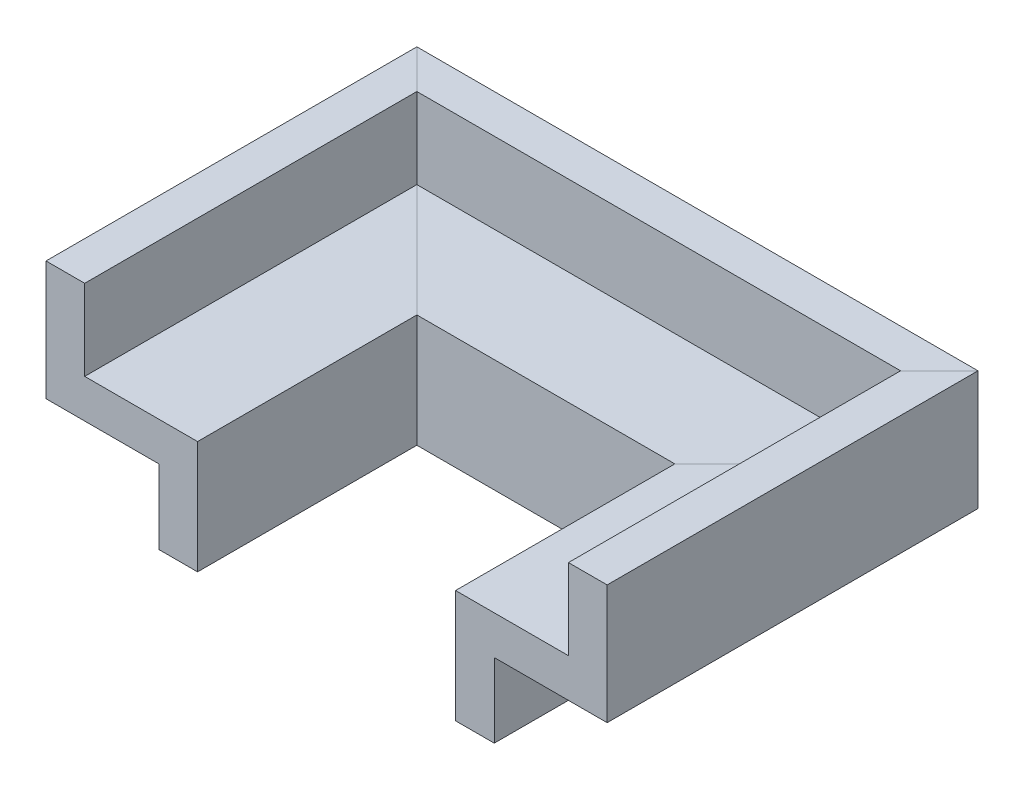
ISO-10303-21;
HEADER;
FILE_DESCRIPTION(('STEP AP214'),'2;1');
FILE_NAME('part.step','',(''),(''),'','','');
FILE_SCHEMA(('AUTOMOTIVE_DESIGN { 1 0 10303 214 1 1 1 1 }'));
ENDSEC;
DATA;
#1=APPLICATION_CONTEXT('core data for automotive mechanical design processes');
#2=APPLICATION_PROTOCOL_DEFINITION('international standard','automotive_design',2000,#1);
#3=PRODUCT_CONTEXT('',#1,'mechanical');
#4=PRODUCT('Part','Part','',(#3));
#5=PRODUCT_RELATED_PRODUCT_CATEGORY('part','',(#4));
#6=PRODUCT_DEFINITION_FORMATION('','',#4);
#7=PRODUCT_DEFINITION_CONTEXT('part definition',#1,'design');
#8=PRODUCT_DEFINITION('design','',#6,#7);
#9=PRODUCT_DEFINITION_SHAPE('','',#8);
#10=(LENGTH_UNIT() NAMED_UNIT(*) SI_UNIT(.MILLI.,.METRE.));
#11=(NAMED_UNIT(*) PLANE_ANGLE_UNIT() SI_UNIT($,.RADIAN.));
#12=(NAMED_UNIT(*) SI_UNIT($,.STERADIAN.) SOLID_ANGLE_UNIT());
#13=UNCERTAINTY_MEASURE_WITH_UNIT(LENGTH_MEASURE(1.E-05),#10,'distance_accuracy_value','');
#14=(GEOMETRIC_REPRESENTATION_CONTEXT(3) GLOBAL_UNCERTAINTY_ASSIGNED_CONTEXT((#13)) GLOBAL_UNIT_ASSIGNED_CONTEXT((#10,
#11,#12)) REPRESENTATION_CONTEXT('',''));
#15=CARTESIAN_POINT('',(0.,0.,0.));
#16=DIRECTION('',(0.,0.,1.));
#17=DIRECTION('',(1.,0.,0.));
#18=AXIS2_PLACEMENT_3D('',#15,#16,#17);
#19=CARTESIAN_POINT('',(0.,0.,0.));
#20=DIRECTION('',(0.,0.,-1.));
#21=DIRECTION('',(-1.,0.,0.));
#22=AXIS2_PLACEMENT_3D('',#19,#20,#21);
#23=PLANE('',#22);
#24=DIRECTION('',(0.,-1.,0.));
#25=VECTOR('',#24,1.);
#26=CARTESIAN_POINT('',(52.,-23.,0.));
#27=LINE('',#26,#25);
#28=CARTESIAN_POINT('',(52.,0.,0.));
#29=VERTEX_POINT('',#28);
#30=CARTESIAN_POINT('',(52.,-23.,0.));
#31=VERTEX_POINT('',#30);
#32=EDGE_CURVE('E127',#29,#31,#27,.T.);
#33=ORIENTED_EDGE('',*,*,#32,.F.);
#34=DIRECTION('',(-1.,0.,0.));
#35=VECTOR('',#34,1.);
#36=CARTESIAN_POINT('',(52.,0.,0.));
#37=LINE('',#36,#35);
#38=CARTESIAN_POINT('',(87.,0.,0.));
#39=VERTEX_POINT('',#38);
#40=EDGE_CURVE('E181',#39,#29,#37,.T.);
#41=ORIENTED_EDGE('',*,*,#40,.F.);
#42=DIRECTION('',(0.,-1.,0.));
#43=VECTOR('',#42,1.);
#44=CARTESIAN_POINT('',(87.,0.,0.));
#45=LINE('',#44,#43);
#46=CARTESIAN_POINT('',(87.,37.,0.));
#47=VERTEX_POINT('',#46);
#48=EDGE_CURVE('E178',#47,#39,#45,.T.);
#49=ORIENTED_EDGE('',*,*,#48,.F.);
#50=DIRECTION('',(1.,0.,0.));
#51=VECTOR('',#50,1.);
#52=CARTESIAN_POINT('',(87.,37.,0.));
#53=LINE('',#52,#51);
#54=CARTESIAN_POINT('',(75.,37.,0.));
#55=VERTEX_POINT('',#54);
#56=EDGE_CURVE('E175',#55,#47,#53,.T.);
#57=ORIENTED_EDGE('',*,*,#56,.F.);
#58=DIRECTION('',(0.,1.,0.));
#59=VECTOR('',#58,1.);
#60=CARTESIAN_POINT('',(75.,37.,0.));
#61=LINE('',#60,#59);
#62=CARTESIAN_POINT('',(75.,12.,0.));
#63=VERTEX_POINT('',#62);
#64=EDGE_CURVE('E172',#63,#55,#61,.T.);
#65=ORIENTED_EDGE('',*,*,#64,.F.);
#66=DIRECTION('',(1.,0.,0.));
#67=VECTOR('',#66,1.);
#68=CARTESIAN_POINT('',(75.,12.,0.));
#69=LINE('',#68,#67);
#70=CARTESIAN_POINT('',(40.,12.,0.));
#71=VERTEX_POINT('',#70);
#72=EDGE_CURVE('E130',#71,#63,#69,.T.);
#73=ORIENTED_EDGE('',*,*,#72,.F.);
#74=DIRECTION('',(0.,1.,0.));
#75=VECTOR('',#74,1.);
#76=CARTESIAN_POINT('',(40.,12.,0.));
#77=LINE('',#76,#75);
#78=CARTESIAN_POINT('',(40.,-23.,0.));
#79=VERTEX_POINT('',#78);
#80=EDGE_CURVE('E111',#79,#71,#77,.T.);
#81=ORIENTED_EDGE('',*,*,#80,.F.);
#82=DIRECTION('',(-1.,0.,0.));
#83=VECTOR('',#82,1.);
#84=CARTESIAN_POINT('',(40.,-23.,0.));
#85=LINE('',#84,#83);
#86=EDGE_CURVE('E118',#31,#79,#85,.T.);
#87=ORIENTED_EDGE('',*,*,#86,.F.);
#88=EDGE_LOOP('',(#33,#41,#49,#57,#65,#73,#81,#87));
#89=FACE_BOUND('',#88,.T.);
#90=ADVANCED_FACE('F39',(#89),#23,.F.);
#91=CARTESIAN_POINT('',(0.,0.,0.));
#92=DIRECTION('',(0.,0.,1.));
#93=DIRECTION('',(1.,0.,0.));
#94=AXIS2_PLACEMENT_3D('',#91,#92,#93);
#95=PLANE('',#94);
#96=DIRECTION('',(0.,-1.,0.));
#97=VECTOR('',#96,1.);
#98=CARTESIAN_POINT('',(-52.,-23.,0.));
#99=LINE('',#98,#97);
#100=CARTESIAN_POINT('',(-52.,0.,0.));
#101=VERTEX_POINT('',#100);
#102=CARTESIAN_POINT('',(-52.,-23.,0.));
#103=VERTEX_POINT('',#102);
#104=EDGE_CURVE('E252',#101,#103,#99,.T.);
#105=ORIENTED_EDGE('',*,*,#104,.T.);
#106=DIRECTION('',(1.,0.,0.));
#107=VECTOR('',#106,1.);
#108=CARTESIAN_POINT('',(-40.,-23.,0.));
#109=LINE('',#108,#107);
#110=CARTESIAN_POINT('',(-40.,-23.,0.));
#111=VERTEX_POINT('',#110);
#112=EDGE_CURVE('E247',#103,#111,#109,.T.);
#113=ORIENTED_EDGE('',*,*,#112,.T.);
#114=DIRECTION('',(0.,1.,0.));
#115=VECTOR('',#114,1.);
#116=CARTESIAN_POINT('',(-40.,12.,0.));
#117=LINE('',#116,#115);
#118=CARTESIAN_POINT('',(-40.,12.,0.));
#119=VERTEX_POINT('',#118);
#120=EDGE_CURVE('E240',#111,#119,#117,.T.);
#121=ORIENTED_EDGE('',*,*,#120,.T.);
#122=DIRECTION('',(-1.,0.,0.));
#123=VECTOR('',#122,1.);
#124=CARTESIAN_POINT('',(-75.,12.,0.));
#125=LINE('',#124,#123);
#126=CARTESIAN_POINT('',(-75.,12.,0.));
#127=VERTEX_POINT('',#126);
#128=EDGE_CURVE('E292',#119,#127,#125,.T.);
#129=ORIENTED_EDGE('',*,*,#128,.T.);
#130=DIRECTION('',(0.,1.,0.));
#131=VECTOR('',#130,1.);
#132=CARTESIAN_POINT('',(-75.,37.,0.));
#133=LINE('',#132,#131);
#134=CARTESIAN_POINT('',(-75.,37.,0.));
#135=VERTEX_POINT('',#134);
#136=EDGE_CURVE('E284',#127,#135,#133,.T.);
#137=ORIENTED_EDGE('',*,*,#136,.T.);
#138=DIRECTION('',(-1.,0.,0.));
#139=VECTOR('',#138,1.);
#140=CARTESIAN_POINT('',(-87.,37.,0.));
#141=LINE('',#140,#139);
#142=CARTESIAN_POINT('',(-87.,37.,0.));
#143=VERTEX_POINT('',#142);
#144=EDGE_CURVE('E276',#135,#143,#141,.T.);
#145=ORIENTED_EDGE('',*,*,#144,.T.);
#146=DIRECTION('',(0.,-1.,0.));
#147=VECTOR('',#146,1.);
#148=CARTESIAN_POINT('',(-87.,0.,0.));
#149=LINE('',#148,#147);
#150=CARTESIAN_POINT('',(-87.,0.,0.));
#151=VERTEX_POINT('',#150);
#152=EDGE_CURVE('E268',#143,#151,#149,.T.);
#153=ORIENTED_EDGE('',*,*,#152,.T.);
#154=DIRECTION('',(1.,0.,0.));
#155=VECTOR('',#154,1.);
#156=CARTESIAN_POINT('',(-52.,0.,0.));
#157=LINE('',#156,#155);
#158=EDGE_CURVE('E260',#151,#101,#157,.T.);
#159=ORIENTED_EDGE('',*,*,#158,.T.);
#160=EDGE_LOOP('',(#105,#113,#121,#129,#137,#145,#153,#159));
#161=FACE_BOUND('',#160,.T.);
#162=ADVANCED_FACE('F388',(#161),#95,.T.);
#163=CARTESIAN_POINT('',(40.,12.,-118.6));
#164=DIRECTION('',(1.,0.,0.));
#165=DIRECTION('',(0.,1.,0.));
#166=AXIS2_PLACEMENT_3D('',#163,#164,#165);
#167=PLANE('',#166);
#168=DIRECTION('',(0.,-1.,0.));
#169=VECTOR('',#168,1.);
#170=CARTESIAN_POINT('',(40.,12.,-68.));
#171=LINE('',#170,#169);
#172=CARTESIAN_POINT('',(40.,12.,-68.));
#173=VERTEX_POINT('',#172);
#174=CARTESIAN_POINT('',(40.,-23.,-68.));
#175=VERTEX_POINT('',#174);
#176=EDGE_CURVE('E135',#173,#175,#171,.T.);
#177=ORIENTED_EDGE('',*,*,#176,.T.);
#178=DIRECTION('',(0.,0.,1.));
#179=VECTOR('',#178,1.);
#180=CARTESIAN_POINT('',(40.,-23.,-118.6));
#181=LINE('',#180,#179);
#182=EDGE_CURVE('E42',#175,#79,#181,.T.);
#183=ORIENTED_EDGE('',*,*,#182,.T.);
#184=ORIENTED_EDGE('',*,*,#80,.T.);
#185=DIRECTION('',(0.,0.,1.));
#186=VECTOR('',#185,1.);
#187=CARTESIAN_POINT('',(40.,12.,-118.6));
#188=LINE('',#187,#186);
#189=EDGE_CURVE('E139',#173,#71,#188,.T.);
#190=ORIENTED_EDGE('',*,*,#189,.F.);
#191=EDGE_LOOP('',(#177,#183,#184,#190));
#192=FACE_BOUND('',#191,.T.);
#193=ADVANCED_FACE('F134',(#192),#167,.F.);
#194=CARTESIAN_POINT('',(75.,12.,-118.6));
#195=DIRECTION('',(0.,-1.,0.));
#196=DIRECTION('',(0.,0.,-1.));
#197=AXIS2_PLACEMENT_3D('',#194,#195,#196);
#198=PLANE('',#197);
#199=DIRECTION('',(-0.707106781186548,0.,0.707106781186548));
#200=VECTOR('',#199,1.);
#201=CARTESIAN_POINT('',(-7.8,12.,-20.2));
#202=LINE('',#201,#200);
#203=CARTESIAN_POINT('',(75.,12.,-103.));
#204=VERTEX_POINT('',#203);
#205=EDGE_CURVE('E237',#204,#173,#202,.T.);
#206=ORIENTED_EDGE('',*,*,#205,.T.);
#207=ORIENTED_EDGE('',*,*,#189,.T.);
#208=ORIENTED_EDGE('',*,*,#72,.T.);
#209=DIRECTION('',(0.,0.,1.));
#210=VECTOR('',#209,1.);
#211=CARTESIAN_POINT('',(75.,12.,-118.6));
#212=LINE('',#211,#210);
#213=EDGE_CURVE('E145',#204,#63,#212,.T.);
#214=ORIENTED_EDGE('',*,*,#213,.F.);
#215=EDGE_LOOP('',(#206,#207,#208,#214));
#216=FACE_BOUND('',#215,.T.);
#217=ADVANCED_FACE('F400',(#216),#198,.F.);
#218=CARTESIAN_POINT('',(75.,37.,-118.6));
#219=DIRECTION('',(1.,0.,0.));
#220=DIRECTION('',(0.,1.,0.));
#221=AXIS2_PLACEMENT_3D('',#218,#219,#220);
#222=PLANE('',#221);
#223=DIRECTION('',(0.,-1.,0.));
#224=VECTOR('',#223,1.);
#225=CARTESIAN_POINT('',(75.,36.9999999999999,-103.));
#226=LINE('',#225,#224);
#227=CARTESIAN_POINT('',(75.,37.,-103.));
#228=VERTEX_POINT('',#227);
#229=EDGE_CURVE('E233',#228,#204,#226,.T.);
#230=ORIENTED_EDGE('',*,*,#229,.T.);
#231=ORIENTED_EDGE('',*,*,#213,.T.);
#232=ORIENTED_EDGE('',*,*,#64,.T.);
#233=DIRECTION('',(0.,0.,1.));
#234=VECTOR('',#233,1.);
#235=CARTESIAN_POINT('',(75.,37.,-118.6));
#236=LINE('',#235,#234);
#237=EDGE_CURVE('E150',#228,#55,#236,.T.);
#238=ORIENTED_EDGE('',*,*,#237,.F.);
#239=EDGE_LOOP('',(#230,#231,#232,#238));
#240=FACE_BOUND('',#239,.T.);
#241=ADVANCED_FACE('F403',(#240),#222,.F.);
#242=CARTESIAN_POINT('',(87.,37.,-118.6));
#243=DIRECTION('',(0.,-1.,0.));
#244=DIRECTION('',(0.,0.,-1.));
#245=AXIS2_PLACEMENT_3D('',#242,#243,#244);
#246=PLANE('',#245);
#247=DIRECTION('',(-0.707106781186548,0.,0.707106781186548));
#248=VECTOR('',#247,1.);
#249=CARTESIAN_POINT('',(-1.8,37.,-26.2));
#250=LINE('',#249,#248);
#251=CARTESIAN_POINT('',(87.,37.,-115.));
#252=VERTEX_POINT('',#251);
#253=EDGE_CURVE('E229',#252,#228,#250,.T.);
#254=ORIENTED_EDGE('',*,*,#253,.T.);
#255=ORIENTED_EDGE('',*,*,#237,.T.);
#256=ORIENTED_EDGE('',*,*,#56,.T.);
#257=DIRECTION('',(0.,0.,1.));
#258=VECTOR('',#257,1.);
#259=CARTESIAN_POINT('',(87.,37.,-118.6));
#260=LINE('',#259,#258);
#261=EDGE_CURVE('E156',#252,#47,#260,.T.);
#262=ORIENTED_EDGE('',*,*,#261,.F.);
#263=EDGE_LOOP('',(#254,#255,#256,#262));
#264=FACE_BOUND('',#263,.T.);
#265=ADVANCED_FACE('F406',(#264),#246,.F.);
#266=CARTESIAN_POINT('',(87.,0.,-118.6));
#267=DIRECTION('',(-1.,0.,0.));
#268=DIRECTION('',(0.,0.,1.));
#269=AXIS2_PLACEMENT_3D('',#266,#267,#268);
#270=PLANE('',#269);
#271=DIRECTION('',(0.,1.,0.));
#272=VECTOR('',#271,1.);
#273=CARTESIAN_POINT('',(87.,0.,-115.));
#274=LINE('',#273,#272);
#275=CARTESIAN_POINT('',(87.,0.,-115.));
#276=VERTEX_POINT('',#275);
#277=EDGE_CURVE('E225',#276,#252,#274,.T.);
#278=ORIENTED_EDGE('',*,*,#277,.T.);
#279=ORIENTED_EDGE('',*,*,#261,.T.);
#280=ORIENTED_EDGE('',*,*,#48,.T.);
#281=DIRECTION('',(0.,0.,1.));
#282=VECTOR('',#281,1.);
#283=CARTESIAN_POINT('',(87.,0.,-118.6));
#284=LINE('',#283,#282);
#285=EDGE_CURVE('E160',#276,#39,#284,.T.);
#286=ORIENTED_EDGE('',*,*,#285,.F.);
#287=EDGE_LOOP('',(#278,#279,#280,#286));
#288=FACE_BOUND('',#287,.T.);
#289=ADVANCED_FACE('F410',(#288),#270,.F.);
#290=CARTESIAN_POINT('',(52.,0.,-118.6));
#291=DIRECTION('',(0.,1.,0.));
#292=DIRECTION('',(-1.,0.,0.));
#293=AXIS2_PLACEMENT_3D('',#290,#291,#292);
#294=PLANE('',#293);
#295=DIRECTION('',(0.707106781186548,0.,-0.707106781186548));
#296=VECTOR('',#295,1.);
#297=CARTESIAN_POINT('',(-19.3,0.,-8.7));
#298=LINE('',#297,#296);
#299=CARTESIAN_POINT('',(52.,0.,-80.));
#300=VERTEX_POINT('',#299);
#301=EDGE_CURVE('E221',#300,#276,#298,.T.);
#302=ORIENTED_EDGE('',*,*,#301,.T.);
#303=ORIENTED_EDGE('',*,*,#285,.T.);
#304=ORIENTED_EDGE('',*,*,#40,.T.);
#305=DIRECTION('',(0.,0.,1.));
#306=VECTOR('',#305,1.);
#307=CARTESIAN_POINT('',(52.,0.,-118.6));
#308=LINE('',#307,#306);
#309=EDGE_CURVE('E164',#300,#29,#308,.T.);
#310=ORIENTED_EDGE('',*,*,#309,.F.);
#311=EDGE_LOOP('',(#302,#303,#304,#310));
#312=FACE_BOUND('',#311,.T.);
#313=ADVANCED_FACE('F414',(#312),#294,.F.);
#314=CARTESIAN_POINT('',(52.,-23.,-118.6));
#315=DIRECTION('',(-1.,0.,0.));
#316=DIRECTION('',(0.,0.,1.));
#317=AXIS2_PLACEMENT_3D('',#314,#315,#316);
#318=PLANE('',#317);
#319=DIRECTION('',(0.,1.,0.));
#320=VECTOR('',#319,1.);
#321=CARTESIAN_POINT('',(52.,-23.,-80.));
#322=LINE('',#321,#320);
#323=CARTESIAN_POINT('',(52.,-23.,-80.));
#324=VERTEX_POINT('',#323);
#325=EDGE_CURVE('E217',#324,#300,#322,.T.);
#326=ORIENTED_EDGE('',*,*,#325,.T.);
#327=ORIENTED_EDGE('',*,*,#309,.T.);
#328=ORIENTED_EDGE('',*,*,#32,.T.);
#329=DIRECTION('',(0.,0.,1.));
#330=VECTOR('',#329,1.);
#331=CARTESIAN_POINT('',(52.,-23.,-118.6));
#332=LINE('',#331,#330);
#333=EDGE_CURVE('E123',#324,#31,#332,.T.);
#334=ORIENTED_EDGE('',*,*,#333,.F.);
#335=EDGE_LOOP('',(#326,#327,#328,#334));
#336=FACE_BOUND('',#335,.T.);
#337=ADVANCED_FACE('F433',(#336),#318,.F.);
#338=CARTESIAN_POINT('',(40.,-23.,-118.6));
#339=DIRECTION('',(0.,1.,0.));
#340=DIRECTION('',(0.,0.,1.));
#341=AXIS2_PLACEMENT_3D('',#338,#339,#340);
#342=PLANE('',#341);
#343=DIRECTION('',(0.707106781186548,0.,-0.707106781186548));
#344=VECTOR('',#343,1.);
#345=CARTESIAN_POINT('',(-25.3,-23.,-2.70000000000001));
#346=LINE('',#345,#344);
#347=EDGE_CURVE('E188',#175,#324,#346,.T.);
#348=ORIENTED_EDGE('',*,*,#347,.T.);
#349=ORIENTED_EDGE('',*,*,#333,.T.);
#350=ORIENTED_EDGE('',*,*,#86,.T.);
#351=ORIENTED_EDGE('',*,*,#182,.F.);
#352=EDGE_LOOP('',(#348,#349,#350,#351));
#353=FACE_BOUND('',#352,.T.);
#354=ADVANCED_FACE('F120',(#353),#342,.F.);
#355=CARTESIAN_POINT('',(-90.6,-23.,-68.));
#356=DIRECTION('',(0.,1.,0.));
#357=DIRECTION('',(0.,0.,1.));
#358=AXIS2_PLACEMENT_3D('',#355,#356,#357);
#359=PLANE('',#358);
#360=DIRECTION('',(1.,0.,0.));
#361=VECTOR('',#360,1.);
#362=CARTESIAN_POINT('',(-90.6,-23.,-68.));
#363=LINE('',#362,#361);
#364=CARTESIAN_POINT('',(-40.,-23.,-68.));
#365=VERTEX_POINT('',#364);
#366=EDGE_CURVE('E189',#365,#175,#363,.T.);
#367=ORIENTED_EDGE('',*,*,#366,.F.);
#368=DIRECTION('',(-0.707106781186548,0.,-0.707106781186548));
#369=VECTOR('',#368,1.);
#370=CARTESIAN_POINT('',(-6.,-23.,-34.));
#371=LINE('',#370,#369);
#372=CARTESIAN_POINT('',(-52.,-23.,-80.));
#373=VERTEX_POINT('',#372);
#374=EDGE_CURVE('E245',#365,#373,#371,.T.);
#375=ORIENTED_EDGE('',*,*,#374,.T.);
#376=DIRECTION('',(1.,0.,0.));
#377=VECTOR('',#376,1.);
#378=CARTESIAN_POINT('',(-90.6,-23.,-80.));
#379=LINE('',#378,#377);
#380=EDGE_CURVE('E138',#373,#324,#379,.T.);
#381=ORIENTED_EDGE('',*,*,#380,.T.);
#382=ORIENTED_EDGE('',*,*,#347,.F.);
#383=EDGE_LOOP('',(#367,#375,#381,#382));
#384=FACE_BOUND('',#383,.T.);
#385=ADVANCED_FACE('F429',(#384),#359,.F.);
#386=CARTESIAN_POINT('',(-90.6,-23.,-80.));
#387=DIRECTION('',(0.,0.,1.));
#388=DIRECTION('',(1.,0.,0.));
#389=AXIS2_PLACEMENT_3D('',#386,#387,#388);
#390=PLANE('',#389);
#391=ORIENTED_EDGE('',*,*,#380,.F.);
#392=DIRECTION('',(0.,1.,0.));
#393=VECTOR('',#392,1.);
#394=CARTESIAN_POINT('',(-52.,-23.,-80.));
#395=LINE('',#394,#393);
#396=CARTESIAN_POINT('',(-52.,0.,-80.));
#397=VERTEX_POINT('',#396);
#398=EDGE_CURVE('E311',#373,#397,#395,.T.);
#399=ORIENTED_EDGE('',*,*,#398,.T.);
#400=DIRECTION('',(1.,0.,0.));
#401=VECTOR('',#400,1.);
#402=CARTESIAN_POINT('',(-90.6,0.,-80.));
#403=LINE('',#402,#401);
#404=EDGE_CURVE('E143',#397,#300,#403,.T.);
#405=ORIENTED_EDGE('',*,*,#404,.T.);
#406=ORIENTED_EDGE('',*,*,#325,.F.);
#407=EDGE_LOOP('',(#391,#399,#405,#406));
#408=FACE_BOUND('',#407,.T.);
#409=ADVANCED_FACE('F431',(#408),#390,.F.);
#410=CARTESIAN_POINT('',(-90.6,0.,-80.));
#411=DIRECTION('',(0.,1.,0.));
#412=DIRECTION('',(0.,0.,1.));
#413=AXIS2_PLACEMENT_3D('',#410,#411,#412);
#414=PLANE('',#413);
#415=ORIENTED_EDGE('',*,*,#404,.F.);
#416=DIRECTION('',(-0.707106781186548,0.,-0.707106781186548));
#417=VECTOR('',#416,1.);
#418=CARTESIAN_POINT('',(-12.,0.,-40.));
#419=LINE('',#418,#417);
#420=CARTESIAN_POINT('',(-87.,0.,-115.));
#421=VERTEX_POINT('',#420);
#422=EDGE_CURVE('E315',#397,#421,#419,.T.);
#423=ORIENTED_EDGE('',*,*,#422,.T.);
#424=DIRECTION('',(1.,0.,0.));
#425=VECTOR('',#424,1.);
#426=CARTESIAN_POINT('',(-90.6,0.,-115.));
#427=LINE('',#426,#425);
#428=EDGE_CURVE('E208',#421,#276,#427,.T.);
#429=ORIENTED_EDGE('',*,*,#428,.T.);
#430=ORIENTED_EDGE('',*,*,#301,.F.);
#431=EDGE_LOOP('',(#415,#423,#429,#430));
#432=FACE_BOUND('',#431,.T.);
#433=ADVANCED_FACE('F417',(#432),#414,.F.);
#434=CARTESIAN_POINT('',(-90.6,0.,-115.));
#435=DIRECTION('',(0.,0.,1.));
#436=DIRECTION('',(1.,0.,0.));
#437=AXIS2_PLACEMENT_3D('',#434,#435,#436);
#438=PLANE('',#437);
#439=ORIENTED_EDGE('',*,*,#428,.F.);
#440=DIRECTION('',(0.,1.,0.));
#441=VECTOR('',#440,1.);
#442=CARTESIAN_POINT('',(-87.,0.,-115.));
#443=LINE('',#442,#441);
#444=CARTESIAN_POINT('',(-87.,37.,-115.));
#445=VERTEX_POINT('',#444);
#446=EDGE_CURVE('E319',#421,#445,#443,.T.);
#447=ORIENTED_EDGE('',*,*,#446,.T.);
#448=DIRECTION('',(1.,0.,0.));
#449=VECTOR('',#448,1.);
#450=CARTESIAN_POINT('',(-90.6,37.,-115.));
#451=LINE('',#450,#449);
#452=EDGE_CURVE('E204',#445,#252,#451,.T.);
#453=ORIENTED_EDGE('',*,*,#452,.T.);
#454=ORIENTED_EDGE('',*,*,#277,.F.);
#455=EDGE_LOOP('',(#439,#447,#453,#454));
#456=FACE_BOUND('',#455,.T.);
#457=ADVANCED_FACE('F383',(#456),#438,.F.);
#458=CARTESIAN_POINT('',(-90.6,37.,-115.));
#459=DIRECTION('',(0.,-1.,0.));
#460=DIRECTION('',(0.,0.,-1.));
#461=AXIS2_PLACEMENT_3D('',#458,#459,#460);
#462=PLANE('',#461);
#463=ORIENTED_EDGE('',*,*,#452,.F.);
#464=DIRECTION('',(0.707106781186548,0.,0.707106781186548));
#465=VECTOR('',#464,1.);
#466=CARTESIAN_POINT('',(-29.5,37.,-57.5));
#467=LINE('',#466,#465);
#468=CARTESIAN_POINT('',(-75.,37.,-103.));
#469=VERTEX_POINT('',#468);
#470=EDGE_CURVE('E323',#445,#469,#467,.T.);
#471=ORIENTED_EDGE('',*,*,#470,.T.);
#472=DIRECTION('',(1.,0.,0.));
#473=VECTOR('',#472,1.);
#474=CARTESIAN_POINT('',(-90.6,37.,-103.));
#475=LINE('',#474,#473);
#476=EDGE_CURVE('E200',#469,#228,#475,.T.);
#477=ORIENTED_EDGE('',*,*,#476,.T.);
#478=ORIENTED_EDGE('',*,*,#253,.F.);
#479=EDGE_LOOP('',(#463,#471,#477,#478));
#480=FACE_BOUND('',#479,.T.);
#481=ADVANCED_FACE('F379',(#480),#462,.F.);
#482=CARTESIAN_POINT('',(-90.6,37.,-103.));
#483=DIRECTION('',(0.,0.,-1.));
#484=DIRECTION('',(0.,1.,0.));
#485=AXIS2_PLACEMENT_3D('',#482,#483,#484);
#486=PLANE('',#485);
#487=ORIENTED_EDGE('',*,*,#476,.F.);
#488=DIRECTION('',(0.,-1.,0.));
#489=VECTOR('',#488,1.);
#490=CARTESIAN_POINT('',(-75.,36.9999999999999,-103.));
#491=LINE('',#490,#489);
#492=CARTESIAN_POINT('',(-75.,12.,-103.));
#493=VERTEX_POINT('',#492);
#494=EDGE_CURVE('E49',#469,#493,#491,.T.);
#495=ORIENTED_EDGE('',*,*,#494,.T.);
#496=DIRECTION('',(1.,0.,0.));
#497=VECTOR('',#496,1.);
#498=CARTESIAN_POINT('',(-90.6,12.,-103.));
#499=LINE('',#498,#497);
#500=EDGE_CURVE('E196',#493,#204,#499,.T.);
#501=ORIENTED_EDGE('',*,*,#500,.T.);
#502=ORIENTED_EDGE('',*,*,#229,.F.);
#503=EDGE_LOOP('',(#487,#495,#501,#502));
#504=FACE_BOUND('',#503,.T.);
#505=ADVANCED_FACE('F331',(#504),#486,.F.);
#506=CARTESIAN_POINT('',(-90.6,12.,-103.));
#507=DIRECTION('',(0.,-1.,0.));
#508=DIRECTION('',(0.,0.,-1.));
#509=AXIS2_PLACEMENT_3D('',#506,#507,#508);
#510=PLANE('',#509);
#511=ORIENTED_EDGE('',*,*,#500,.F.);
#512=DIRECTION('',(0.707106781186548,0.,0.707106781186548));
#513=VECTOR('',#512,1.);
#514=CARTESIAN_POINT('',(-23.5,12.,-51.5));
#515=LINE('',#514,#513);
#516=CARTESIAN_POINT('',(-40.,12.,-68.));
#517=VERTEX_POINT('',#516);
#518=EDGE_CURVE('E11',#493,#517,#515,.T.);
#519=ORIENTED_EDGE('',*,*,#518,.T.);
#520=DIRECTION('',(1.,0.,0.));
#521=VECTOR('',#520,1.);
#522=CARTESIAN_POINT('',(-90.6,12.,-68.));
#523=LINE('',#522,#521);
#524=EDGE_CURVE('E192',#517,#173,#523,.T.);
#525=ORIENTED_EDGE('',*,*,#524,.T.);
#526=ORIENTED_EDGE('',*,*,#205,.F.);
#527=EDGE_LOOP('',(#511,#519,#525,#526));
#528=FACE_BOUND('',#527,.T.);
#529=ADVANCED_FACE('F398',(#528),#510,.F.);
#530=CARTESIAN_POINT('',(-90.6,12.,-68.));
#531=DIRECTION('',(0.,0.,-1.));
#532=DIRECTION('',(0.,1.,0.));
#533=AXIS2_PLACEMENT_3D('',#530,#531,#532);
#534=PLANE('',#533);
#535=ORIENTED_EDGE('',*,*,#524,.F.);
#536=DIRECTION('',(0.,-1.,0.));
#537=VECTOR('',#536,1.);
#538=CARTESIAN_POINT('',(-40.,12.,-68.));
#539=LINE('',#538,#537);
#540=EDGE_CURVE('E241',#517,#365,#539,.T.);
#541=ORIENTED_EDGE('',*,*,#540,.T.);
#542=ORIENTED_EDGE('',*,*,#366,.T.);
#543=ORIENTED_EDGE('',*,*,#176,.F.);
#544=EDGE_LOOP('',(#535,#541,#542,#543));
#545=FACE_BOUND('',#544,.T.);
#546=ADVANCED_FACE('F396',(#545),#534,.F.);
#547=CARTESIAN_POINT('',(-40.,-23.,0.));
#548=DIRECTION('',(0.,1.,0.));
#549=DIRECTION('',(0.,0.,1.));
#550=AXIS2_PLACEMENT_3D('',#547,#548,#549);
#551=PLANE('',#550);
#552=DIRECTION('',(0.,0.,-1.));
#553=VECTOR('',#552,1.);
#554=CARTESIAN_POINT('',(-40.,-23.,0.));
#555=LINE('',#554,#553);
#556=EDGE_CURVE('E251',#111,#365,#555,.T.);
#557=ORIENTED_EDGE('',*,*,#556,.F.);
#558=ORIENTED_EDGE('',*,*,#112,.F.);
#559=DIRECTION('',(0.,0.,-1.));
#560=VECTOR('',#559,1.);
#561=CARTESIAN_POINT('',(-52.,-23.,0.));
#562=LINE('',#561,#560);
#563=EDGE_CURVE('E246',#103,#373,#562,.T.);
#564=ORIENTED_EDGE('',*,*,#563,.T.);
#565=ORIENTED_EDGE('',*,*,#374,.F.);
#566=EDGE_LOOP('',(#557,#558,#564,#565));
#567=FACE_BOUND('',#566,.T.);
#568=ADVANCED_FACE('F426',(#567),#551,.F.);
#569=CARTESIAN_POINT('',(-52.,-23.,0.));
#570=DIRECTION('',(1.,0.,0.));
#571=DIRECTION('',(0.,0.,-1.));
#572=AXIS2_PLACEMENT_3D('',#569,#570,#571);
#573=PLANE('',#572);
#574=ORIENTED_EDGE('',*,*,#563,.F.);
#575=ORIENTED_EDGE('',*,*,#104,.F.);
#576=DIRECTION('',(0.,0.,-1.));
#577=VECTOR('',#576,1.);
#578=CARTESIAN_POINT('',(-52.,0.,0.));
#579=LINE('',#578,#577);
#580=EDGE_CURVE('E256',#101,#397,#579,.T.);
#581=ORIENTED_EDGE('',*,*,#580,.T.);
#582=ORIENTED_EDGE('',*,*,#398,.F.);
#583=EDGE_LOOP('',(#574,#575,#581,#582));
#584=FACE_BOUND('',#583,.T.);
#585=ADVANCED_FACE('F423',(#584),#573,.F.);
#586=CARTESIAN_POINT('',(-52.,0.,0.));
#587=DIRECTION('',(0.,1.,0.));
#588=DIRECTION('',(-1.,0.,0.));
#589=AXIS2_PLACEMENT_3D('',#586,#587,#588);
#590=PLANE('',#589);
#591=ORIENTED_EDGE('',*,*,#580,.F.);
#592=ORIENTED_EDGE('',*,*,#158,.F.);
#593=DIRECTION('',(0.,0.,-1.));
#594=VECTOR('',#593,1.);
#595=CARTESIAN_POINT('',(-87.,0.,0.));
#596=LINE('',#595,#594);
#597=EDGE_CURVE('E264',#151,#421,#596,.T.);
#598=ORIENTED_EDGE('',*,*,#597,.T.);
#599=ORIENTED_EDGE('',*,*,#422,.F.);
#600=EDGE_LOOP('',(#591,#592,#598,#599));
#601=FACE_BOUND('',#600,.T.);
#602=ADVANCED_FACE('F420',(#601),#590,.F.);
#603=CARTESIAN_POINT('',(-87.,0.,0.));
#604=DIRECTION('',(1.,0.,0.));
#605=DIRECTION('',(0.,0.,-1.));
#606=AXIS2_PLACEMENT_3D('',#603,#604,#605);
#607=PLANE('',#606);
#608=ORIENTED_EDGE('',*,*,#597,.F.);
#609=ORIENTED_EDGE('',*,*,#152,.F.);
#610=DIRECTION('',(0.,0.,-1.));
#611=VECTOR('',#610,1.);
#612=CARTESIAN_POINT('',(-87.,37.,0.));
#613=LINE('',#612,#611);
#614=EDGE_CURVE('E272',#143,#445,#613,.T.);
#615=ORIENTED_EDGE('',*,*,#614,.T.);
#616=ORIENTED_EDGE('',*,*,#446,.F.);
#617=EDGE_LOOP('',(#608,#609,#615,#616));
#618=FACE_BOUND('',#617,.T.);
#619=ADVANCED_FACE('F386',(#618),#607,.F.);
#620=CARTESIAN_POINT('',(-87.,37.,0.));
#621=DIRECTION('',(0.,-1.,0.));
#622=DIRECTION('',(0.,0.,-1.));
#623=AXIS2_PLACEMENT_3D('',#620,#621,#622);
#624=PLANE('',#623);
#625=ORIENTED_EDGE('',*,*,#614,.F.);
#626=ORIENTED_EDGE('',*,*,#144,.F.);
#627=DIRECTION('',(0.,0.,-1.));
#628=VECTOR('',#627,1.);
#629=CARTESIAN_POINT('',(-75.,37.,0.));
#630=LINE('',#629,#628);
#631=EDGE_CURVE('E280',#135,#469,#630,.T.);
#632=ORIENTED_EDGE('',*,*,#631,.T.);
#633=ORIENTED_EDGE('',*,*,#470,.F.);
#634=EDGE_LOOP('',(#625,#626,#632,#633));
#635=FACE_BOUND('',#634,.T.);
#636=ADVANCED_FACE('F377',(#635),#624,.F.);
#637=CARTESIAN_POINT('',(-75.,37.,0.));
#638=DIRECTION('',(-1.,0.,0.));
#639=DIRECTION('',(0.,-1.,0.));
#640=AXIS2_PLACEMENT_3D('',#637,#638,#639);
#641=PLANE('',#640);
#642=ORIENTED_EDGE('',*,*,#631,.F.);
#643=ORIENTED_EDGE('',*,*,#136,.F.);
#644=DIRECTION('',(0.,0.,-1.));
#645=VECTOR('',#644,1.);
#646=CARTESIAN_POINT('',(-75.,12.,0.));
#647=LINE('',#646,#645);
#648=EDGE_CURVE('E288',#127,#493,#647,.T.);
#649=ORIENTED_EDGE('',*,*,#648,.T.);
#650=ORIENTED_EDGE('',*,*,#494,.F.);
#651=EDGE_LOOP('',(#642,#643,#649,#650));
#652=FACE_BOUND('',#651,.T.);
#653=ADVANCED_FACE('F335',(#652),#641,.F.);
#654=CARTESIAN_POINT('',(-75.,12.,0.));
#655=DIRECTION('',(0.,-1.,0.));
#656=DIRECTION('',(0.,0.,-1.));
#657=AXIS2_PLACEMENT_3D('',#654,#655,#656);
#658=PLANE('',#657);
#659=ORIENTED_EDGE('',*,*,#648,.F.);
#660=ORIENTED_EDGE('',*,*,#128,.F.);
#661=DIRECTION('',(0.,0.,-1.));
#662=VECTOR('',#661,1.);
#663=CARTESIAN_POINT('',(-40.,12.,0.));
#664=LINE('',#663,#662);
#665=EDGE_CURVE('E296',#119,#517,#664,.T.);
#666=ORIENTED_EDGE('',*,*,#665,.T.);
#667=ORIENTED_EDGE('',*,*,#518,.F.);
#668=EDGE_LOOP('',(#659,#660,#666,#667));
#669=FACE_BOUND('',#668,.T.);
#670=ADVANCED_FACE('F338',(#669),#658,.F.);
#671=CARTESIAN_POINT('',(-40.,12.,0.));
#672=DIRECTION('',(-1.,0.,0.));
#673=DIRECTION('',(0.,-1.,0.));
#674=AXIS2_PLACEMENT_3D('',#671,#672,#673);
#675=PLANE('',#674);
#676=ORIENTED_EDGE('',*,*,#665,.F.);
#677=ORIENTED_EDGE('',*,*,#120,.F.);
#678=ORIENTED_EDGE('',*,*,#556,.T.);
#679=ORIENTED_EDGE('',*,*,#540,.F.);
#680=EDGE_LOOP('',(#676,#677,#678,#679));
#681=FACE_BOUND('',#680,.T.);
#682=ADVANCED_FACE('F393',(#681),#675,.F.);
#683=CLOSED_SHELL('',(#90,#162,#193,#217,#241,#265,#289,#313,#337,#354,#385,#409,#433,#457,#481,
#505,#529,#546,#568,#585,#602,#619,#636,#653,#670,#682));
#684=MANIFOLD_SOLID_BREP('B2',#683);
#685=ADVANCED_BREP_SHAPE_REPRESENTATION('',(#18,#684),#14);
#686=SHAPE_DEFINITION_REPRESENTATION(#9,#685);
ENDSEC;
END-ISO-10303-21;
